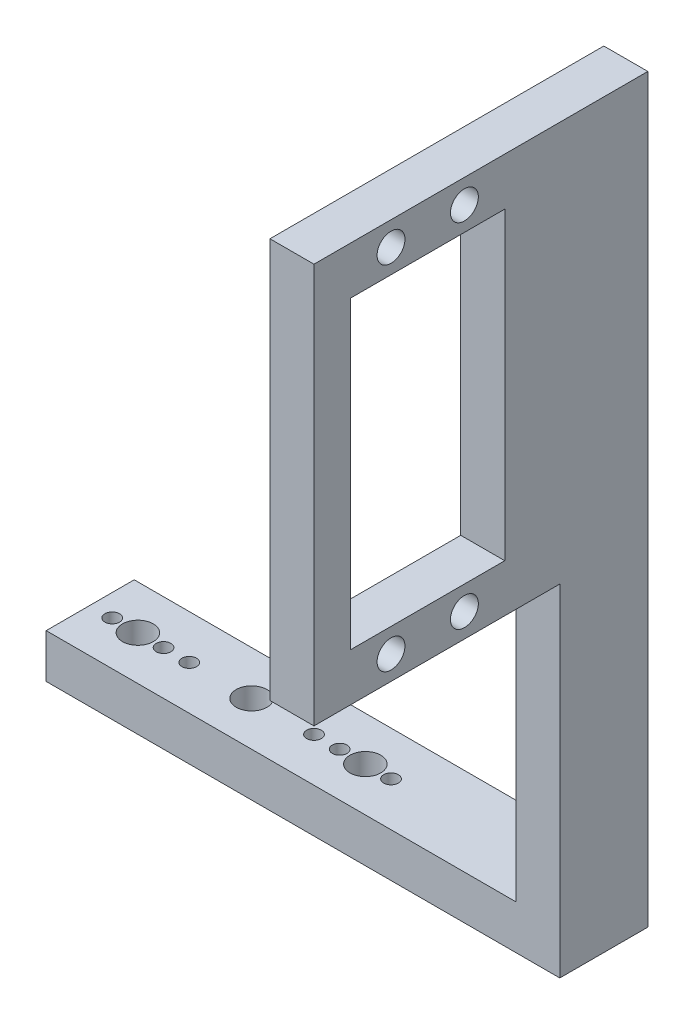
ISO-10303-21;
HEADER;
FILE_DESCRIPTION(('STEP AP214'),'2;1');
FILE_NAME('part.step','',(''),(''),'','','');
FILE_SCHEMA(('AUTOMOTIVE_DESIGN { 1 0 10303 214 1 1 1 1 }'));
ENDSEC;
DATA;
#1=APPLICATION_CONTEXT('core data for automotive mechanical design processes');
#2=APPLICATION_PROTOCOL_DEFINITION('international standard','automotive_design',2000,#1);
#3=PRODUCT_CONTEXT('',#1,'mechanical');
#4=PRODUCT('Part','Part','',(#3));
#5=PRODUCT_RELATED_PRODUCT_CATEGORY('part','',(#4));
#6=PRODUCT_DEFINITION_FORMATION('','',#4);
#7=PRODUCT_DEFINITION_CONTEXT('part definition',#1,'design');
#8=PRODUCT_DEFINITION('design','',#6,#7);
#9=PRODUCT_DEFINITION_SHAPE('','',#8);
#10=(LENGTH_UNIT() NAMED_UNIT(*) SI_UNIT(.MILLI.,.METRE.));
#11=(NAMED_UNIT(*) PLANE_ANGLE_UNIT() SI_UNIT($,.RADIAN.));
#12=(NAMED_UNIT(*) SI_UNIT($,.STERADIAN.) SOLID_ANGLE_UNIT());
#13=UNCERTAINTY_MEASURE_WITH_UNIT(LENGTH_MEASURE(1.E-05),#10,'distance_accuracy_value','');
#14=(GEOMETRIC_REPRESENTATION_CONTEXT(3) GLOBAL_UNCERTAINTY_ASSIGNED_CONTEXT((#13)) GLOBAL_UNIT_ASSIGNED_CONTEXT((#10,
#11,#12)) REPRESENTATION_CONTEXT('',''));
#15=CARTESIAN_POINT('',(0.,0.,0.));
#16=DIRECTION('',(0.,0.,1.));
#17=DIRECTION('',(1.,0.,0.));
#18=AXIS2_PLACEMENT_3D('',#15,#16,#17);
#19=CARTESIAN_POINT('',(-15.5,6.,0.));
#20=DIRECTION('',(0.,-1.,0.));
#21=DIRECTION('',(0.,0.,-1.));
#22=AXIS2_PLACEMENT_3D('',#19,#20,#21);
#23=CYLINDRICAL_SURFACE('',#22,1.);
#24=CARTESIAN_POINT('',(-15.5,0.,0.));
#25=DIRECTION('',(0.,1.,0.));
#26=DIRECTION('',(0.,0.,1.));
#27=AXIS2_PLACEMENT_3D('',#24,#25,#26);
#28=CIRCLE('',#27,1.);
#29=CARTESIAN_POINT('',(-15.5,0.,1.00000000000005));
#30=VERTEX_POINT('',#29);
#31=EDGE_CURVE('E288',#30,#30,#28,.T.);
#32=ORIENTED_EDGE('',*,*,#31,.F.);
#33=EDGE_LOOP('',(#32));
#34=FACE_BOUND('',#33,.T.);
#35=CARTESIAN_POINT('',(-15.5,2.5,0.));
#36=DIRECTION('',(0.,1.,0.));
#37=DIRECTION('',(0.,0.,1.));
#38=AXIS2_PLACEMENT_3D('',#35,#36,#37);
#39=CIRCLE('',#38,1.);
#40=CARTESIAN_POINT('',(-15.5,2.5,1.00000000000005));
#41=VERTEX_POINT('',#40);
#42=EDGE_CURVE('E41',#41,#41,#39,.T.);
#43=ORIENTED_EDGE('',*,*,#42,.T.);
#44=EDGE_LOOP('',(#43));
#45=FACE_BOUND('',#44,.T.);
#46=ADVANCED_FACE('F37',(#34,#45),#23,.F.);
#47=CARTESIAN_POINT('',(15.5,6.,0.));
#48=DIRECTION('',(0.,-1.,0.));
#49=DIRECTION('',(0.,0.,-1.));
#50=AXIS2_PLACEMENT_3D('',#47,#48,#49);
#51=CYLINDRICAL_SURFACE('',#50,1.);
#52=CARTESIAN_POINT('',(15.5,0.,0.));
#53=DIRECTION('',(0.,1.,0.));
#54=DIRECTION('',(0.,0.,1.));
#55=AXIS2_PLACEMENT_3D('',#52,#53,#54);
#56=CIRCLE('',#55,1.);
#57=CARTESIAN_POINT('',(15.5,0.,1.00000000000009));
#58=VERTEX_POINT('',#57);
#59=EDGE_CURVE('E249',#58,#58,#56,.F.);
#60=ORIENTED_EDGE('',*,*,#59,.T.);
#61=EDGE_LOOP('',(#60));
#62=FACE_BOUND('',#61,.T.);
#63=CARTESIAN_POINT('',(15.5,2.5,0.));
#64=DIRECTION('',(0.,1.,0.));
#65=DIRECTION('',(0.,0.,1.));
#66=AXIS2_PLACEMENT_3D('',#63,#64,#65);
#67=CIRCLE('',#66,1.);
#68=CARTESIAN_POINT('',(15.5,2.5,1.00000000000009));
#69=VERTEX_POINT('',#68);
#70=EDGE_CURVE('E299',#69,#69,#67,.F.);
#71=ORIENTED_EDGE('',*,*,#70,.F.);
#72=EDGE_LOOP('',(#71));
#73=FACE_BOUND('',#72,.T.);
#74=ADVANCED_FACE('F39',(#62,#73),#51,.F.);
#75=CARTESIAN_POINT('',(0.,6.,0.));
#76=DIRECTION('',(0.,-1.,0.));
#77=DIRECTION('',(0.,0.,-1.));
#78=AXIS2_PLACEMENT_3D('',#75,#76,#77);
#79=CYLINDRICAL_SURFACE('',#78,2.1);
#80=CARTESIAN_POINT('',(0.,6.,0.));
#81=DIRECTION('',(0.,1.,0.));
#82=DIRECTION('',(0.,0.,1.));
#83=AXIS2_PLACEMENT_3D('',#80,#81,#82);
#84=CIRCLE('',#83,2.1);
#85=CARTESIAN_POINT('',(0.,6.,2.1));
#86=VERTEX_POINT('',#85);
#87=EDGE_CURVE('E255',#86,#86,#84,.T.);
#88=ORIENTED_EDGE('',*,*,#87,.T.);
#89=EDGE_LOOP('',(#88));
#90=FACE_BOUND('',#89,.T.);
#91=CARTESIAN_POINT('',(0.,2.,0.));
#92=DIRECTION('',(0.,-1.,0.));
#93=DIRECTION('',(0.,0.,-1.));
#94=AXIS2_PLACEMENT_3D('',#91,#92,#93);
#95=CIRCLE('',#94,2.1);
#96=CARTESIAN_POINT('',(0.,2.,-2.1));
#97=VERTEX_POINT('',#96);
#98=EDGE_CURVE('E162',#97,#97,#95,.T.);
#99=ORIENTED_EDGE('',*,*,#98,.T.);
#100=EDGE_LOOP('',(#99));
#101=FACE_BOUND('',#100,.T.);
#102=ADVANCED_FACE('F350',(#90,#101),#79,.F.);
#103=CARTESIAN_POINT('',(0.,6.,-6.));
#104=DIRECTION('',(0.,0.,-1.));
#105=DIRECTION('',(-1.,0.,0.));
#106=AXIS2_PLACEMENT_3D('',#103,#104,#105);
#107=PLANE('',#106);
#108=DIRECTION('',(1.,0.,0.));
#109=VECTOR('',#108,1.);
#110=CARTESIAN_POINT('',(0.,0.,-6.));
#111=LINE('',#110,#109);
#112=CARTESIAN_POINT('',(-22.,0.,-5.99999999999999));
#113=VERTEX_POINT('',#112);
#114=CARTESIAN_POINT('',(48.,0.,-6.00000000000001));
#115=VERTEX_POINT('',#114);
#116=EDGE_CURVE('E147',#113,#115,#111,.T.);
#117=ORIENTED_EDGE('',*,*,#116,.F.);
#118=DIRECTION('',(0.,-1.,0.));
#119=VECTOR('',#118,1.);
#120=CARTESIAN_POINT('',(-22.,6.,-5.99999999999999));
#121=LINE('',#120,#119);
#122=CARTESIAN_POINT('',(-22.,6.,-5.99999999999999));
#123=VERTEX_POINT('',#122);
#124=EDGE_CURVE('E11',#123,#113,#121,.T.);
#125=ORIENTED_EDGE('',*,*,#124,.F.);
#126=DIRECTION('',(1.,0.,0.));
#127=VECTOR('',#126,1.);
#128=CARTESIAN_POINT('',(0.,6.,-6.));
#129=LINE('',#128,#127);
#130=CARTESIAN_POINT('',(42.,6.,-6.00000000000001));
#131=VERTEX_POINT('',#130);
#132=EDGE_CURVE('E73',#123,#131,#129,.T.);
#133=ORIENTED_EDGE('',*,*,#132,.T.);
#134=DIRECTION('',(0.,1.,0.));
#135=VECTOR('',#134,1.);
#136=CARTESIAN_POINT('',(42.,0.,-6.00000000000001));
#137=LINE('',#136,#135);
#138=CARTESIAN_POINT('',(42.,101.,-6.00000000000001));
#139=VERTEX_POINT('',#138);
#140=EDGE_CURVE('E198',#131,#139,#137,.T.);
#141=ORIENTED_EDGE('',*,*,#140,.T.);
#142=DIRECTION('',(-1.,0.,0.));
#143=VECTOR('',#142,1.);
#144=CARTESIAN_POINT('',(48.,101.,-6.00000000000001));
#145=LINE('',#144,#143);
#146=CARTESIAN_POINT('',(48.,101.,-6.00000000000001));
#147=VERTEX_POINT('',#146);
#148=EDGE_CURVE('E232',#147,#139,#145,.T.);
#149=ORIENTED_EDGE('',*,*,#148,.F.);
#150=DIRECTION('',(0.,1.,0.));
#151=VECTOR('',#150,1.);
#152=CARTESIAN_POINT('',(48.,0.,-6.00000000000001));
#153=LINE('',#152,#151);
#154=EDGE_CURVE('E150',#115,#147,#153,.T.);
#155=ORIENTED_EDGE('',*,*,#154,.F.);
#156=EDGE_LOOP('',(#117,#125,#133,#141,#149,#155));
#157=FACE_BOUND('',#156,.T.);
#158=ADVANCED_FACE('F372',(#157),#107,.T.);
#159=CARTESIAN_POINT('',(-22.,6.,0.));
#160=DIRECTION('',(1.,0.,0.));
#161=DIRECTION('',(0.,0.,-1.));
#162=AXIS2_PLACEMENT_3D('',#159,#160,#161);
#163=PLANE('',#162);
#164=DIRECTION('',(0.,0.,1.));
#165=VECTOR('',#164,1.);
#166=CARTESIAN_POINT('',(-22.,0.,0.));
#167=LINE('',#166,#165);
#168=CARTESIAN_POINT('',(-22.,0.,6.00000000000001));
#169=VERTEX_POINT('',#168);
#170=EDGE_CURVE('E140',#113,#169,#167,.T.);
#171=ORIENTED_EDGE('',*,*,#170,.T.);
#172=DIRECTION('',(0.,-1.,0.));
#173=VECTOR('',#172,1.);
#174=CARTESIAN_POINT('',(-22.,6.,6.00000000000001));
#175=LINE('',#174,#173);
#176=CARTESIAN_POINT('',(-22.,6.,6.00000000000001));
#177=VERTEX_POINT('',#176);
#178=EDGE_CURVE('E47',#177,#169,#175,.T.);
#179=ORIENTED_EDGE('',*,*,#178,.F.);
#180=DIRECTION('',(0.,0.,1.));
#181=VECTOR('',#180,1.);
#182=CARTESIAN_POINT('',(-22.,6.,0.));
#183=LINE('',#182,#181);
#184=EDGE_CURVE('E251',#123,#177,#183,.T.);
#185=ORIENTED_EDGE('',*,*,#184,.F.);
#186=ORIENTED_EDGE('',*,*,#124,.T.);
#187=EDGE_LOOP('',(#171,#179,#185,#186));
#188=FACE_BOUND('',#187,.T.);
#189=ADVANCED_FACE('F376',(#188),#163,.F.);
#190=CARTESIAN_POINT('',(12.,6.,0.));
#191=DIRECTION('',(0.,-1.,0.));
#192=DIRECTION('',(0.,0.,-1.));
#193=AXIS2_PLACEMENT_3D('',#190,#191,#192);
#194=CYLINDRICAL_SURFACE('',#193,1.);
#195=CARTESIAN_POINT('',(12.,6.,0.));
#196=DIRECTION('',(0.,1.,0.));
#197=DIRECTION('',(0.,0.,1.));
#198=AXIS2_PLACEMENT_3D('',#195,#196,#197);
#199=CIRCLE('',#198,1.);
#200=CARTESIAN_POINT('',(12.,6.,1.00000000000005));
#201=VERTEX_POINT('',#200);
#202=EDGE_CURVE('E270',#201,#201,#199,.F.);
#203=ORIENTED_EDGE('',*,*,#202,.F.);
#204=EDGE_LOOP('',(#203));
#205=FACE_BOUND('',#204,.T.);
#206=CARTESIAN_POINT('',(12.,0.,0.));
#207=DIRECTION('',(0.,1.,0.));
#208=DIRECTION('',(0.,0.,1.));
#209=AXIS2_PLACEMENT_3D('',#206,#207,#208);
#210=CIRCLE('',#209,1.);
#211=CARTESIAN_POINT('',(12.,0.,1.00000000000005));
#212=VERTEX_POINT('',#211);
#213=EDGE_CURVE('E294',#212,#212,#210,.F.);
#214=ORIENTED_EDGE('',*,*,#213,.T.);
#215=EDGE_LOOP('',(#214));
#216=FACE_BOUND('',#215,.T.);
#217=ADVANCED_FACE('F378',(#205,#216),#194,.F.);
#218=CARTESIAN_POINT('',(-19.,6.,0.));
#219=DIRECTION('',(0.,-1.,0.));
#220=DIRECTION('',(0.,0.,-1.));
#221=AXIS2_PLACEMENT_3D('',#218,#219,#220);
#222=CYLINDRICAL_SURFACE('',#221,1.);
#223=CARTESIAN_POINT('',(-19.,6.,0.));
#224=DIRECTION('',(0.,1.,0.));
#225=DIRECTION('',(0.,0.,1.));
#226=AXIS2_PLACEMENT_3D('',#223,#224,#225);
#227=CIRCLE('',#226,1.);
#228=CARTESIAN_POINT('',(-19.,6.,1.00000000000008));
#229=VERTEX_POINT('',#228);
#230=EDGE_CURVE('E267',#229,#229,#227,.T.);
#231=ORIENTED_EDGE('',*,*,#230,.T.);
#232=EDGE_LOOP('',(#231));
#233=FACE_BOUND('',#232,.T.);
#234=CARTESIAN_POINT('',(-19.,0.,0.));
#235=DIRECTION('',(0.,1.,0.));
#236=DIRECTION('',(0.,0.,1.));
#237=AXIS2_PLACEMENT_3D('',#234,#235,#236);
#238=CIRCLE('',#237,1.);
#239=CARTESIAN_POINT('',(-19.,0.,1.00000000000008));
#240=VERTEX_POINT('',#239);
#241=EDGE_CURVE('E291',#240,#240,#238,.T.);
#242=ORIENTED_EDGE('',*,*,#241,.F.);
#243=EDGE_LOOP('',(#242));
#244=FACE_BOUND('',#243,.T.);
#245=ADVANCED_FACE('F356',(#233,#244),#222,.F.);
#246=CARTESIAN_POINT('',(-12.,6.,0.));
#247=DIRECTION('',(0.,-1.,0.));
#248=DIRECTION('',(0.,0.,-1.));
#249=AXIS2_PLACEMENT_3D('',#246,#247,#248);
#250=CYLINDRICAL_SURFACE('',#249,1.);
#251=CARTESIAN_POINT('',(-12.,6.,0.));
#252=DIRECTION('',(0.,1.,0.));
#253=DIRECTION('',(0.,0.,1.));
#254=AXIS2_PLACEMENT_3D('',#251,#252,#253);
#255=CIRCLE('',#254,1.);
#256=CARTESIAN_POINT('',(-12.,6.,1.00000000000002));
#257=VERTEX_POINT('',#256);
#258=EDGE_CURVE('E264',#257,#257,#255,.T.);
#259=ORIENTED_EDGE('',*,*,#258,.T.);
#260=EDGE_LOOP('',(#259));
#261=FACE_BOUND('',#260,.T.);
#262=CARTESIAN_POINT('',(-12.,0.,0.));
#263=DIRECTION('',(0.,1.,0.));
#264=DIRECTION('',(0.,0.,1.));
#265=AXIS2_PLACEMENT_3D('',#262,#263,#264);
#266=CIRCLE('',#265,1.);
#267=CARTESIAN_POINT('',(-12.,0.,1.00000000000002));
#268=VERTEX_POINT('',#267);
#269=EDGE_CURVE('E285',#268,#268,#266,.T.);
#270=ORIENTED_EDGE('',*,*,#269,.F.);
#271=EDGE_LOOP('',(#270));
#272=FACE_BOUND('',#271,.T.);
#273=ADVANCED_FACE('F358',(#261,#272),#250,.F.);
#274=CARTESIAN_POINT('',(-8.50000000000001,6.,0.));
#275=DIRECTION('',(0.,-1.,0.));
#276=DIRECTION('',(0.,0.,-1.));
#277=AXIS2_PLACEMENT_3D('',#274,#275,#276);
#278=CYLINDRICAL_SURFACE('',#277,1.);
#279=CARTESIAN_POINT('',(-8.50000000000001,6.,0.));
#280=DIRECTION('',(0.,1.,0.));
#281=DIRECTION('',(0.,0.,1.));
#282=AXIS2_PLACEMENT_3D('',#279,#280,#281);
#283=CIRCLE('',#282,1.);
#284=CARTESIAN_POINT('',(-8.50000000000001,6.,1.));
#285=VERTEX_POINT('',#284);
#286=EDGE_CURVE('E261',#285,#285,#283,.T.);
#287=ORIENTED_EDGE('',*,*,#286,.T.);
#288=EDGE_LOOP('',(#287));
#289=FACE_BOUND('',#288,.T.);
#290=CARTESIAN_POINT('',(-8.50000000000001,0.,0.));
#291=DIRECTION('',(0.,1.,0.));
#292=DIRECTION('',(0.,0.,1.));
#293=AXIS2_PLACEMENT_3D('',#290,#291,#292);
#294=CIRCLE('',#293,1.);
#295=CARTESIAN_POINT('',(-8.50000000000001,0.,1.));
#296=VERTEX_POINT('',#295);
#297=EDGE_CURVE('E282',#296,#296,#294,.T.);
#298=ORIENTED_EDGE('',*,*,#297,.F.);
#299=EDGE_LOOP('',(#298));
#300=FACE_BOUND('',#299,.T.);
#301=ADVANCED_FACE('F361',(#289,#300),#278,.F.);
#302=CARTESIAN_POINT('',(8.5,6.,0.));
#303=DIRECTION('',(0.,-1.,0.));
#304=DIRECTION('',(0.,0.,-1.));
#305=AXIS2_PLACEMENT_3D('',#302,#303,#304);
#306=CYLINDRICAL_SURFACE('',#305,1.);
#307=CARTESIAN_POINT('',(8.5,6.,0.));
#308=DIRECTION('',(0.,1.,0.));
#309=DIRECTION('',(0.,0.,1.));
#310=AXIS2_PLACEMENT_3D('',#307,#308,#309);
#311=CIRCLE('',#310,1.);
#312=CARTESIAN_POINT('',(8.5,6.,0.999999999999999));
#313=VERTEX_POINT('',#312);
#314=EDGE_CURVE('E258',#313,#313,#311,.T.);
#315=ORIENTED_EDGE('',*,*,#314,.T.);
#316=EDGE_LOOP('',(#315));
#317=FACE_BOUND('',#316,.T.);
#318=CARTESIAN_POINT('',(8.5,0.,0.));
#319=DIRECTION('',(0.,1.,0.));
#320=DIRECTION('',(0.,0.,1.));
#321=AXIS2_PLACEMENT_3D('',#318,#319,#320);
#322=CIRCLE('',#321,1.);
#323=CARTESIAN_POINT('',(8.5,0.,0.999999999999999));
#324=VERTEX_POINT('',#323);
#325=EDGE_CURVE('E139',#324,#324,#322,.T.);
#326=ORIENTED_EDGE('',*,*,#325,.F.);
#327=EDGE_LOOP('',(#326));
#328=FACE_BOUND('',#327,.T.);
#329=ADVANCED_FACE('F365',(#317,#328),#306,.F.);
#330=CARTESIAN_POINT('',(0.,6.,6.));
#331=DIRECTION('',(0.,0.,-1.));
#332=DIRECTION('',(-1.,0.,0.));
#333=AXIS2_PLACEMENT_3D('',#330,#331,#332);
#334=PLANE('',#333);
#335=DIRECTION('',(1.,0.,0.));
#336=VECTOR('',#335,1.);
#337=CARTESIAN_POINT('',(0.,0.,6.));
#338=LINE('',#337,#336);
#339=CARTESIAN_POINT('',(48.,0.,5.99999999999999));
#340=VERTEX_POINT('',#339);
#341=EDGE_CURVE('E130',#169,#340,#338,.T.);
#342=ORIENTED_EDGE('',*,*,#341,.T.);
#343=DIRECTION('',(0.,1.,0.));
#344=VECTOR('',#343,1.);
#345=CARTESIAN_POINT('',(48.,0.,5.99999999999999));
#346=LINE('',#345,#344);
#347=CARTESIAN_POINT('',(48.,46.5,6.));
#348=VERTEX_POINT('',#347);
#349=EDGE_CURVE('E135',#340,#348,#346,.T.);
#350=ORIENTED_EDGE('',*,*,#349,.T.);
#351=DIRECTION('',(-1.,0.,0.));
#352=VECTOR('',#351,1.);
#353=CARTESIAN_POINT('',(48.,46.5,6.));
#354=LINE('',#353,#352);
#355=CARTESIAN_POINT('',(42.,46.5,6.));
#356=VERTEX_POINT('',#355);
#357=EDGE_CURVE('E195',#348,#356,#354,.T.);
#358=ORIENTED_EDGE('',*,*,#357,.T.);
#359=DIRECTION('',(0.,1.,0.));
#360=VECTOR('',#359,1.);
#361=CARTESIAN_POINT('',(42.,0.,5.99999999999999));
#362=LINE('',#361,#360);
#363=CARTESIAN_POINT('',(42.,6.,6.));
#364=VERTEX_POINT('',#363);
#365=EDGE_CURVE('E196',#364,#356,#362,.T.);
#366=ORIENTED_EDGE('',*,*,#365,.F.);
#367=DIRECTION('',(1.,0.,0.));
#368=VECTOR('',#367,1.);
#369=CARTESIAN_POINT('',(0.,6.,6.));
#370=LINE('',#369,#368);
#371=EDGE_CURVE('E56',#177,#364,#370,.T.);
#372=ORIENTED_EDGE('',*,*,#371,.F.);
#373=ORIENTED_EDGE('',*,*,#178,.T.);
#374=EDGE_LOOP('',(#342,#350,#358,#366,#372,#373));
#375=FACE_BOUND('',#374,.T.);
#376=ADVANCED_FACE('F132',(#375),#334,.F.);
#377=CARTESIAN_POINT('',(19.,6.,1.17702227244026E-13));
#378=DIRECTION('',(0.,-1.,0.));
#379=DIRECTION('',(0.,0.,-1.));
#380=AXIS2_PLACEMENT_3D('',#377,#378,#379);
#381=CYLINDRICAL_SURFACE('',#380,1.);
#382=CARTESIAN_POINT('',(19.,6.,1.17702227244026E-13));
#383=DIRECTION('',(0.,1.,0.));
#384=DIRECTION('',(0.,0.,1.));
#385=AXIS2_PLACEMENT_3D('',#382,#383,#384);
#386=CIRCLE('',#385,1.);
#387=CARTESIAN_POINT('',(19.,6.,1.00000000000012));
#388=VERTEX_POINT('',#387);
#389=EDGE_CURVE('E273',#388,#388,#386,.F.);
#390=ORIENTED_EDGE('',*,*,#389,.F.);
#391=EDGE_LOOP('',(#390));
#392=FACE_BOUND('',#391,.T.);
#393=CARTESIAN_POINT('',(19.,0.,1.17702227244026E-13));
#394=DIRECTION('',(0.,1.,0.));
#395=DIRECTION('',(0.,0.,1.));
#396=AXIS2_PLACEMENT_3D('',#393,#394,#395);
#397=CIRCLE('',#396,1.);
#398=CARTESIAN_POINT('',(19.,0.,1.00000000000012));
#399=VERTEX_POINT('',#398);
#400=EDGE_CURVE('E252',#399,#399,#397,.F.);
#401=ORIENTED_EDGE('',*,*,#400,.T.);
#402=EDGE_LOOP('',(#401));
#403=FACE_BOUND('',#402,.T.);
#404=ADVANCED_FACE('F339',(#392,#403),#381,.F.);
#405=CARTESIAN_POINT('',(0.,6.,0.));
#406=DIRECTION('',(0.,1.,0.));
#407=DIRECTION('',(0.,0.,1.));
#408=AXIS2_PLACEMENT_3D('',#405,#406,#407);
#409=PLANE('',#408);
#410=CARTESIAN_POINT('',(-15.5,6.,0.));
#411=DIRECTION('',(0.,1.,0.));
#412=DIRECTION('',(0.,0.,1.));
#413=AXIS2_PLACEMENT_3D('',#410,#411,#412);
#414=CIRCLE('',#413,2.1);
#415=CARTESIAN_POINT('',(-15.5,6.,2.10000000000005));
#416=VERTEX_POINT('',#415);
#417=EDGE_CURVE('E307',#416,#416,#414,.T.);
#418=ORIENTED_EDGE('',*,*,#417,.F.);
#419=EDGE_LOOP('',(#418));
#420=FACE_BOUND('',#419,.T.);
#421=CARTESIAN_POINT('',(15.5,6.,0.));
#422=DIRECTION('',(0.,1.,0.));
#423=DIRECTION('',(0.,0.,1.));
#424=AXIS2_PLACEMENT_3D('',#421,#422,#423);
#425=CIRCLE('',#424,2.1);
#426=CARTESIAN_POINT('',(15.5,6.,2.10000000000009));
#427=VERTEX_POINT('',#426);
#428=EDGE_CURVE('E317',#427,#427,#425,.T.);
#429=ORIENTED_EDGE('',*,*,#428,.F.);
#430=EDGE_LOOP('',(#429));
#431=FACE_BOUND('',#430,.T.);
#432=ORIENTED_EDGE('',*,*,#371,.T.);
#433=DIRECTION('',(0.,0.,1.));
#434=VECTOR('',#433,1.);
#435=CARTESIAN_POINT('',(42.,6.,5.99999999999999));
#436=LINE('',#435,#434);
#437=EDGE_CURVE('E239',#131,#364,#436,.T.);
#438=ORIENTED_EDGE('',*,*,#437,.F.);
#439=ORIENTED_EDGE('',*,*,#132,.F.);
#440=ORIENTED_EDGE('',*,*,#184,.T.);
#441=EDGE_LOOP('',(#432,#438,#439,#440));
#442=FACE_BOUND('',#441,.T.);
#443=ORIENTED_EDGE('',*,*,#87,.F.);
#444=EDGE_LOOP('',(#443));
#445=FACE_BOUND('',#444,.T.);
#446=ORIENTED_EDGE('',*,*,#314,.F.);
#447=EDGE_LOOP('',(#446));
#448=FACE_BOUND('',#447,.T.);
#449=ORIENTED_EDGE('',*,*,#286,.F.);
#450=EDGE_LOOP('',(#449));
#451=FACE_BOUND('',#450,.T.);
#452=ORIENTED_EDGE('',*,*,#258,.F.);
#453=EDGE_LOOP('',(#452));
#454=FACE_BOUND('',#453,.T.);
#455=ORIENTED_EDGE('',*,*,#230,.F.);
#456=EDGE_LOOP('',(#455));
#457=FACE_BOUND('',#456,.T.);
#458=ORIENTED_EDGE('',*,*,#202,.T.);
#459=EDGE_LOOP('',(#458));
#460=FACE_BOUND('',#459,.T.);
#461=ORIENTED_EDGE('',*,*,#389,.T.);
#462=EDGE_LOOP('',(#461));
#463=FACE_BOUND('',#462,.T.);
#464=ADVANCED_FACE('F329',(#420,#431,#442,#445,#448,#451,#454,#457,#460,#463),#409,.T.);
#465=CARTESIAN_POINT('',(0.,0.,0.));
#466=DIRECTION('',(0.,1.,0.));
#467=DIRECTION('',(0.,0.,1.));
#468=AXIS2_PLACEMENT_3D('',#465,#466,#467);
#469=PLANE('',#468);
#470=ORIENTED_EDGE('',*,*,#59,.F.);
#471=EDGE_LOOP('',(#470));
#472=FACE_BOUND('',#471,.T.);
#473=ORIENTED_EDGE('',*,*,#116,.T.);
#474=DIRECTION('',(0.,0.,-1.));
#475=VECTOR('',#474,1.);
#476=CARTESIAN_POINT('',(48.,0.,0.));
#477=LINE('',#476,#475);
#478=EDGE_CURVE('E143',#340,#115,#477,.T.);
#479=ORIENTED_EDGE('',*,*,#478,.F.);
#480=ORIENTED_EDGE('',*,*,#341,.F.);
#481=ORIENTED_EDGE('',*,*,#170,.F.);
#482=EDGE_LOOP('',(#473,#479,#480,#481));
#483=FACE_BOUND('',#482,.T.);
#484=ORIENTED_EDGE('',*,*,#325,.T.);
#485=EDGE_LOOP('',(#484));
#486=FACE_BOUND('',#485,.T.);
#487=ORIENTED_EDGE('',*,*,#297,.T.);
#488=EDGE_LOOP('',(#487));
#489=FACE_BOUND('',#488,.T.);
#490=ORIENTED_EDGE('',*,*,#269,.T.);
#491=EDGE_LOOP('',(#490));
#492=FACE_BOUND('',#491,.T.);
#493=ORIENTED_EDGE('',*,*,#31,.T.);
#494=EDGE_LOOP('',(#493));
#495=FACE_BOUND('',#494,.T.);
#496=ORIENTED_EDGE('',*,*,#241,.T.);
#497=EDGE_LOOP('',(#496));
#498=FACE_BOUND('',#497,.T.);
#499=ORIENTED_EDGE('',*,*,#213,.F.);
#500=EDGE_LOOP('',(#499));
#501=FACE_BOUND('',#500,.T.);
#502=ORIENTED_EDGE('',*,*,#400,.F.);
#503=EDGE_LOOP('',(#502));
#504=FACE_BOUND('',#503,.T.);
#505=CARTESIAN_POINT('',(0.,0.,0.));
#506=DIRECTION('',(0.,-1.,0.));
#507=DIRECTION('',(0.,0.,-1.));
#508=AXIS2_PLACEMENT_3D('',#505,#506,#507);
#509=CIRCLE('',#508,1.);
#510=CARTESIAN_POINT('',(0.,0.,-1.));
#511=VERTEX_POINT('',#510);
#512=EDGE_CURVE('E305',#511,#511,#509,.T.);
#513=ORIENTED_EDGE('',*,*,#512,.F.);
#514=EDGE_LOOP('',(#513));
#515=FACE_BOUND('',#514,.T.);
#516=ADVANCED_FACE('F144',(#472,#483,#486,#489,#492,#495,#498,#501,#504,#515),#469,.F.);
#517=CARTESIAN_POINT('',(42.,0.,0.));
#518=DIRECTION('',(1.,0.,0.));
#519=DIRECTION('',(0.,0.,-1.));
#520=AXIS2_PLACEMENT_3D('',#517,#518,#519);
#521=PLANE('',#520);
#522=CARTESIAN_POINT('',(42.,49.75,19.));
#523=DIRECTION('',(1.,0.,0.));
#524=DIRECTION('',(0.,0.,-1.));
#525=AXIS2_PLACEMENT_3D('',#522,#523,#524);
#526=CIRCLE('',#525,1.9);
#527=CARTESIAN_POINT('',(42.,49.75,17.1));
#528=VERTEX_POINT('',#527);
#529=EDGE_CURVE('E209',#528,#528,#526,.T.);
#530=ORIENTED_EDGE('',*,*,#529,.T.);
#531=EDGE_LOOP('',(#530));
#532=FACE_BOUND('',#531,.T.);
#533=CARTESIAN_POINT('',(42.,49.75,29.));
#534=DIRECTION('',(1.,0.,0.));
#535=DIRECTION('',(0.,0.,-1.));
#536=AXIS2_PLACEMENT_3D('',#533,#534,#535);
#537=CIRCLE('',#536,1.9);
#538=CARTESIAN_POINT('',(42.,49.75,27.1));
#539=VERTEX_POINT('',#538);
#540=EDGE_CURVE('E212',#539,#539,#537,.T.);
#541=ORIENTED_EDGE('',*,*,#540,.T.);
#542=EDGE_LOOP('',(#541));
#543=FACE_BOUND('',#542,.T.);
#544=CARTESIAN_POINT('',(42.,97.75,29.));
#545=DIRECTION('',(1.,0.,0.));
#546=DIRECTION('',(0.,0.,-1.));
#547=AXIS2_PLACEMENT_3D('',#544,#545,#546);
#548=CIRCLE('',#547,1.9);
#549=CARTESIAN_POINT('',(42.,97.75,27.1));
#550=VERTEX_POINT('',#549);
#551=EDGE_CURVE('E215',#550,#550,#548,.T.);
#552=ORIENTED_EDGE('',*,*,#551,.T.);
#553=EDGE_LOOP('',(#552));
#554=FACE_BOUND('',#553,.T.);
#555=CARTESIAN_POINT('',(42.,97.75,19.));
#556=DIRECTION('',(1.,0.,0.));
#557=DIRECTION('',(0.,0.,-1.));
#558=AXIS2_PLACEMENT_3D('',#555,#556,#557);
#559=CIRCLE('',#558,1.9);
#560=CARTESIAN_POINT('',(42.,97.75,17.1));
#561=VERTEX_POINT('',#560);
#562=EDGE_CURVE('E218',#561,#561,#559,.T.);
#563=ORIENTED_EDGE('',*,*,#562,.T.);
#564=EDGE_LOOP('',(#563));
#565=FACE_BOUND('',#564,.T.);
#566=DIRECTION('',(0.,-1.,0.));
#567=VECTOR('',#566,1.);
#568=CARTESIAN_POINT('',(42.,0.,34.5));
#569=LINE('',#568,#567);
#570=CARTESIAN_POINT('',(42.,94.5,34.5));
#571=VERTEX_POINT('',#570);
#572=CARTESIAN_POINT('',(42.,53.,34.5));
#573=VERTEX_POINT('',#572);
#574=EDGE_CURVE('E221',#571,#573,#569,.T.);
#575=ORIENTED_EDGE('',*,*,#574,.T.);
#576=DIRECTION('',(0.,0.,1.));
#577=VECTOR('',#576,1.);
#578=CARTESIAN_POINT('',(42.,53.,0.));
#579=LINE('',#578,#577);
#580=CARTESIAN_POINT('',(42.,53.,13.5));
#581=VERTEX_POINT('',#580);
#582=EDGE_CURVE('E156',#581,#573,#579,.T.);
#583=ORIENTED_EDGE('',*,*,#582,.F.);
#584=DIRECTION('',(0.,-1.,0.));
#585=VECTOR('',#584,1.);
#586=CARTESIAN_POINT('',(42.,0.,13.5));
#587=LINE('',#586,#585);
#588=CARTESIAN_POINT('',(42.,94.5,13.5));
#589=VERTEX_POINT('',#588);
#590=EDGE_CURVE('E159',#589,#581,#587,.T.);
#591=ORIENTED_EDGE('',*,*,#590,.F.);
#592=DIRECTION('',(0.,0.,1.));
#593=VECTOR('',#592,1.);
#594=CARTESIAN_POINT('',(42.,94.5,0.));
#595=LINE('',#594,#593);
#596=EDGE_CURVE('E224',#589,#571,#595,.T.);
#597=ORIENTED_EDGE('',*,*,#596,.T.);
#598=EDGE_LOOP('',(#575,#583,#591,#597));
#599=FACE_BOUND('',#598,.T.);
#600=ORIENTED_EDGE('',*,*,#140,.F.);
#601=ORIENTED_EDGE('',*,*,#437,.T.);
#602=ORIENTED_EDGE('',*,*,#365,.T.);
#603=DIRECTION('',(0.,0.,1.));
#604=VECTOR('',#603,1.);
#605=CARTESIAN_POINT('',(42.,46.5,0.));
#606=LINE('',#605,#604);
#607=CARTESIAN_POINT('',(42.,46.5,39.5));
#608=VERTEX_POINT('',#607);
#609=EDGE_CURVE('E206',#356,#608,#606,.T.);
#610=ORIENTED_EDGE('',*,*,#609,.T.);
#611=DIRECTION('',(0.,-1.,0.));
#612=VECTOR('',#611,1.);
#613=CARTESIAN_POINT('',(42.,0.,39.5));
#614=LINE('',#613,#612);
#615=CARTESIAN_POINT('',(42.,101.,39.5));
#616=VERTEX_POINT('',#615);
#617=EDGE_CURVE('E203',#616,#608,#614,.T.);
#618=ORIENTED_EDGE('',*,*,#617,.F.);
#619=DIRECTION('',(0.,0.,-1.));
#620=VECTOR('',#619,1.);
#621=CARTESIAN_POINT('',(42.,101.,0.));
#622=LINE('',#621,#620);
#623=EDGE_CURVE('E200',#616,#139,#622,.T.);
#624=ORIENTED_EDGE('',*,*,#623,.T.);
#625=EDGE_LOOP('',(#600,#601,#602,#610,#618,#624));
#626=FACE_BOUND('',#625,.T.);
#627=ADVANCED_FACE('F328',(#532,#543,#554,#565,#599,#626),#521,.F.);
#628=CARTESIAN_POINT('',(48.,0.,34.5));
#629=DIRECTION('',(0.,0.,-1.));
#630=DIRECTION('',(0.,1.,0.));
#631=AXIS2_PLACEMENT_3D('',#628,#629,#630);
#632=PLANE('',#631);
#633=ORIENTED_EDGE('',*,*,#574,.F.);
#634=DIRECTION('',(-1.,0.,0.));
#635=VECTOR('',#634,1.);
#636=CARTESIAN_POINT('',(48.,94.5,34.5));
#637=LINE('',#636,#635);
#638=CARTESIAN_POINT('',(48.,94.5,34.5));
#639=VERTEX_POINT('',#638);
#640=EDGE_CURVE('E237',#639,#571,#637,.T.);
#641=ORIENTED_EDGE('',*,*,#640,.F.);
#642=DIRECTION('',(0.,-1.,0.));
#643=VECTOR('',#642,1.);
#644=CARTESIAN_POINT('',(48.,0.,34.5));
#645=LINE('',#644,#643);
#646=CARTESIAN_POINT('',(48.,53.,34.5));
#647=VERTEX_POINT('',#646);
#648=EDGE_CURVE('E184',#639,#647,#645,.T.);
#649=ORIENTED_EDGE('',*,*,#648,.T.);
#650=DIRECTION('',(-1.,0.,0.));
#651=VECTOR('',#650,1.);
#652=CARTESIAN_POINT('',(48.,53.,34.5));
#653=LINE('',#652,#651);
#654=EDGE_CURVE('E229',#647,#573,#653,.T.);
#655=ORIENTED_EDGE('',*,*,#654,.T.);
#656=EDGE_LOOP('',(#633,#641,#649,#655));
#657=FACE_BOUND('',#656,.T.);
#658=ADVANCED_FACE('F336',(#657),#632,.T.);
#659=CARTESIAN_POINT('',(48.,94.5,0.));
#660=DIRECTION('',(0.,-1.,0.));
#661=DIRECTION('',(0.,0.,-1.));
#662=AXIS2_PLACEMENT_3D('',#659,#660,#661);
#663=PLANE('',#662);
#664=ORIENTED_EDGE('',*,*,#596,.F.);
#665=DIRECTION('',(-1.,0.,0.));
#666=VECTOR('',#665,1.);
#667=CARTESIAN_POINT('',(48.,94.5,13.5));
#668=LINE('',#667,#666);
#669=CARTESIAN_POINT('',(48.,94.5,13.5));
#670=VERTEX_POINT('',#669);
#671=EDGE_CURVE('E235',#670,#589,#668,.T.);
#672=ORIENTED_EDGE('',*,*,#671,.F.);
#673=DIRECTION('',(0.,0.,1.));
#674=VECTOR('',#673,1.);
#675=CARTESIAN_POINT('',(48.,94.5,0.));
#676=LINE('',#675,#674);
#677=EDGE_CURVE('E187',#670,#639,#676,.T.);
#678=ORIENTED_EDGE('',*,*,#677,.T.);
#679=ORIENTED_EDGE('',*,*,#640,.T.);
#680=EDGE_LOOP('',(#664,#672,#678,#679));
#681=FACE_BOUND('',#680,.T.);
#682=ADVANCED_FACE('F469',(#681),#663,.T.);
#683=CARTESIAN_POINT('',(48.,0.,13.5));
#684=DIRECTION('',(0.,0.,-1.));
#685=DIRECTION('',(-1.,0.,0.));
#686=AXIS2_PLACEMENT_3D('',#683,#684,#685);
#687=PLANE('',#686);
#688=ORIENTED_EDGE('',*,*,#590,.T.);
#689=DIRECTION('',(-1.,0.,0.));
#690=VECTOR('',#689,1.);
#691=CARTESIAN_POINT('',(48.,53.,13.5));
#692=LINE('',#691,#690);
#693=CARTESIAN_POINT('',(48.,53.,13.5));
#694=VERTEX_POINT('',#693);
#695=EDGE_CURVE('E231',#694,#581,#692,.T.);
#696=ORIENTED_EDGE('',*,*,#695,.F.);
#697=DIRECTION('',(0.,-1.,0.));
#698=VECTOR('',#697,1.);
#699=CARTESIAN_POINT('',(48.,0.,13.5));
#700=LINE('',#699,#698);
#701=EDGE_CURVE('E190',#670,#694,#700,.T.);
#702=ORIENTED_EDGE('',*,*,#701,.F.);
#703=ORIENTED_EDGE('',*,*,#671,.T.);
#704=EDGE_LOOP('',(#688,#696,#702,#703));
#705=FACE_BOUND('',#704,.T.);
#706=ADVANCED_FACE('F479',(#705),#687,.F.);
#707=CARTESIAN_POINT('',(48.,101.,0.));
#708=DIRECTION('',(0.,1.,0.));
#709=DIRECTION('',(0.,0.,1.));
#710=AXIS2_PLACEMENT_3D('',#707,#708,#709);
#711=PLANE('',#710);
#712=ORIENTED_EDGE('',*,*,#623,.F.);
#713=DIRECTION('',(-1.,0.,0.));
#714=VECTOR('',#713,1.);
#715=CARTESIAN_POINT('',(48.,101.,39.5));
#716=LINE('',#715,#714);
#717=CARTESIAN_POINT('',(48.,101.,39.5));
#718=VERTEX_POINT('',#717);
#719=EDGE_CURVE('E243',#718,#616,#716,.T.);
#720=ORIENTED_EDGE('',*,*,#719,.F.);
#721=DIRECTION('',(0.,0.,-1.));
#722=VECTOR('',#721,1.);
#723=CARTESIAN_POINT('',(48.,101.,0.));
#724=LINE('',#723,#722);
#725=EDGE_CURVE('E166',#718,#147,#724,.T.);
#726=ORIENTED_EDGE('',*,*,#725,.T.);
#727=ORIENTED_EDGE('',*,*,#148,.T.);
#728=EDGE_LOOP('',(#712,#720,#726,#727));
#729=FACE_BOUND('',#728,.T.);
#730=ADVANCED_FACE('F388',(#729),#711,.T.);
#731=CARTESIAN_POINT('',(48.,0.,39.5));
#732=DIRECTION('',(0.,0.,-1.));
#733=DIRECTION('',(-1.,0.,0.));
#734=AXIS2_PLACEMENT_3D('',#731,#732,#733);
#735=PLANE('',#734);
#736=ORIENTED_EDGE('',*,*,#617,.T.);
#737=DIRECTION('',(-1.,0.,0.));
#738=VECTOR('',#737,1.);
#739=CARTESIAN_POINT('',(48.,46.5,39.5));
#740=LINE('',#739,#738);
#741=CARTESIAN_POINT('',(48.,46.5,39.5));
#742=VERTEX_POINT('',#741);
#743=EDGE_CURVE('E241',#742,#608,#740,.T.);
#744=ORIENTED_EDGE('',*,*,#743,.F.);
#745=DIRECTION('',(0.,-1.,0.));
#746=VECTOR('',#745,1.);
#747=CARTESIAN_POINT('',(48.,0.,39.5));
#748=LINE('',#747,#746);
#749=EDGE_CURVE('E169',#718,#742,#748,.T.);
#750=ORIENTED_EDGE('',*,*,#749,.F.);
#751=ORIENTED_EDGE('',*,*,#719,.T.);
#752=EDGE_LOOP('',(#736,#744,#750,#751));
#753=FACE_BOUND('',#752,.T.);
#754=ADVANCED_FACE('F391',(#753),#735,.F.);
#755=CARTESIAN_POINT('',(48.,97.75,19.));
#756=DIRECTION('',(-1.,0.,0.));
#757=DIRECTION('',(0.,0.,1.));
#758=AXIS2_PLACEMENT_3D('',#755,#756,#757);
#759=CYLINDRICAL_SURFACE('',#758,1.9);
#760=CARTESIAN_POINT('',(48.,97.75,19.));
#761=DIRECTION('',(1.,0.,0.));
#762=DIRECTION('',(0.,0.,-1.));
#763=AXIS2_PLACEMENT_3D('',#760,#761,#762);
#764=CIRCLE('',#763,1.9);
#765=CARTESIAN_POINT('',(48.,97.75,17.1));
#766=VERTEX_POINT('',#765);
#767=EDGE_CURVE('E181',#766,#766,#764,.T.);
#768=ORIENTED_EDGE('',*,*,#767,.T.);
#769=EDGE_LOOP('',(#768));
#770=FACE_BOUND('',#769,.T.);
#771=ORIENTED_EDGE('',*,*,#562,.F.);
#772=EDGE_LOOP('',(#771));
#773=FACE_BOUND('',#772,.T.);
#774=ADVANCED_FACE('F507',(#770,#773),#759,.F.);
#775=CARTESIAN_POINT('',(48.,97.75,29.));
#776=DIRECTION('',(-1.,0.,0.));
#777=DIRECTION('',(0.,0.,1.));
#778=AXIS2_PLACEMENT_3D('',#775,#776,#777);
#779=CYLINDRICAL_SURFACE('',#778,1.9);
#780=CARTESIAN_POINT('',(48.,97.75,29.));
#781=DIRECTION('',(1.,0.,0.));
#782=DIRECTION('',(0.,0.,-1.));
#783=AXIS2_PLACEMENT_3D('',#780,#781,#782);
#784=CIRCLE('',#783,1.9);
#785=CARTESIAN_POINT('',(48.,97.75,27.1));
#786=VERTEX_POINT('',#785);
#787=EDGE_CURVE('E178',#786,#786,#784,.T.);
#788=ORIENTED_EDGE('',*,*,#787,.T.);
#789=EDGE_LOOP('',(#788));
#790=FACE_BOUND('',#789,.T.);
#791=ORIENTED_EDGE('',*,*,#551,.F.);
#792=EDGE_LOOP('',(#791));
#793=FACE_BOUND('',#792,.T.);
#794=ADVANCED_FACE('F516',(#790,#793),#779,.F.);
#795=CARTESIAN_POINT('',(48.,49.75,29.));
#796=DIRECTION('',(-1.,0.,0.));
#797=DIRECTION('',(0.,0.,1.));
#798=AXIS2_PLACEMENT_3D('',#795,#796,#797);
#799=CYLINDRICAL_SURFACE('',#798,1.9);
#800=CARTESIAN_POINT('',(48.,49.75,29.));
#801=DIRECTION('',(1.,0.,0.));
#802=DIRECTION('',(0.,0.,-1.));
#803=AXIS2_PLACEMENT_3D('',#800,#801,#802);
#804=CIRCLE('',#803,1.9);
#805=CARTESIAN_POINT('',(48.,49.75,27.1));
#806=VERTEX_POINT('',#805);
#807=EDGE_CURVE('E175',#806,#806,#804,.T.);
#808=ORIENTED_EDGE('',*,*,#807,.T.);
#809=EDGE_LOOP('',(#808));
#810=FACE_BOUND('',#809,.T.);
#811=ORIENTED_EDGE('',*,*,#540,.F.);
#812=EDGE_LOOP('',(#811));
#813=FACE_BOUND('',#812,.T.);
#814=ADVANCED_FACE('F526',(#810,#813),#799,.F.);
#815=CARTESIAN_POINT('',(48.,49.75,19.));
#816=DIRECTION('',(-1.,0.,0.));
#817=DIRECTION('',(0.,0.,1.));
#818=AXIS2_PLACEMENT_3D('',#815,#816,#817);
#819=CYLINDRICAL_SURFACE('',#818,1.9);
#820=CARTESIAN_POINT('',(48.,49.75,19.));
#821=DIRECTION('',(1.,0.,0.));
#822=DIRECTION('',(0.,0.,-1.));
#823=AXIS2_PLACEMENT_3D('',#820,#821,#822);
#824=CIRCLE('',#823,1.9);
#825=CARTESIAN_POINT('',(48.,49.75,17.1));
#826=VERTEX_POINT('',#825);
#827=EDGE_CURVE('E172',#826,#826,#824,.T.);
#828=ORIENTED_EDGE('',*,*,#827,.T.);
#829=EDGE_LOOP('',(#828));
#830=FACE_BOUND('',#829,.T.);
#831=ORIENTED_EDGE('',*,*,#529,.F.);
#832=EDGE_LOOP('',(#831));
#833=FACE_BOUND('',#832,.T.);
#834=ADVANCED_FACE('F536',(#830,#833),#819,.F.);
#835=CARTESIAN_POINT('',(48.,46.5,0.));
#836=DIRECTION('',(0.,-1.,0.));
#837=DIRECTION('',(0.,0.,-1.));
#838=AXIS2_PLACEMENT_3D('',#835,#836,#837);
#839=PLANE('',#838);
#840=ORIENTED_EDGE('',*,*,#609,.F.);
#841=ORIENTED_EDGE('',*,*,#357,.F.);
#842=DIRECTION('',(0.,0.,1.));
#843=VECTOR('',#842,1.);
#844=CARTESIAN_POINT('',(48.,46.5,0.));
#845=LINE('',#844,#843);
#846=EDGE_CURVE('E155',#348,#742,#845,.T.);
#847=ORIENTED_EDGE('',*,*,#846,.T.);
#848=ORIENTED_EDGE('',*,*,#743,.T.);
#849=EDGE_LOOP('',(#840,#841,#847,#848));
#850=FACE_BOUND('',#849,.T.);
#851=ADVANCED_FACE('F394',(#850),#839,.T.);
#852=CARTESIAN_POINT('',(48.,53.,0.));
#853=DIRECTION('',(0.,-1.,0.));
#854=DIRECTION('',(0.,0.,-1.));
#855=AXIS2_PLACEMENT_3D('',#852,#853,#854);
#856=PLANE('',#855);
#857=ORIENTED_EDGE('',*,*,#582,.T.);
#858=ORIENTED_EDGE('',*,*,#654,.F.);
#859=DIRECTION('',(0.,0.,1.));
#860=VECTOR('',#859,1.);
#861=CARTESIAN_POINT('',(48.,53.,0.));
#862=LINE('',#861,#860);
#863=EDGE_CURVE('E193',#694,#647,#862,.T.);
#864=ORIENTED_EDGE('',*,*,#863,.F.);
#865=ORIENTED_EDGE('',*,*,#695,.T.);
#866=EDGE_LOOP('',(#857,#858,#864,#865));
#867=FACE_BOUND('',#866,.T.);
#868=ADVANCED_FACE('F555',(#867),#856,.F.);
#869=CARTESIAN_POINT('',(48.,0.,0.));
#870=DIRECTION('',(1.,0.,0.));
#871=DIRECTION('',(0.,0.,-1.));
#872=AXIS2_PLACEMENT_3D('',#869,#870,#871);
#873=PLANE('',#872);
#874=ORIENTED_EDGE('',*,*,#349,.F.);
#875=ORIENTED_EDGE('',*,*,#478,.T.);
#876=ORIENTED_EDGE('',*,*,#154,.T.);
#877=ORIENTED_EDGE('',*,*,#725,.F.);
#878=ORIENTED_EDGE('',*,*,#749,.T.);
#879=ORIENTED_EDGE('',*,*,#846,.F.);
#880=EDGE_LOOP('',(#874,#875,#876,#877,#878,#879));
#881=FACE_BOUND('',#880,.T.);
#882=ORIENTED_EDGE('',*,*,#827,.F.);
#883=EDGE_LOOP('',(#882));
#884=FACE_BOUND('',#883,.T.);
#885=ORIENTED_EDGE('',*,*,#807,.F.);
#886=EDGE_LOOP('',(#885));
#887=FACE_BOUND('',#886,.T.);
#888=ORIENTED_EDGE('',*,*,#787,.F.);
#889=EDGE_LOOP('',(#888));
#890=FACE_BOUND('',#889,.T.);
#891=ORIENTED_EDGE('',*,*,#767,.F.);
#892=EDGE_LOOP('',(#891));
#893=FACE_BOUND('',#892,.T.);
#894=ORIENTED_EDGE('',*,*,#648,.F.);
#895=ORIENTED_EDGE('',*,*,#677,.F.);
#896=ORIENTED_EDGE('',*,*,#701,.T.);
#897=ORIENTED_EDGE('',*,*,#863,.T.);
#898=EDGE_LOOP('',(#894,#895,#896,#897));
#899=FACE_BOUND('',#898,.T.);
#900=ADVANCED_FACE('F152',(#881,#884,#887,#890,#893,#899),#873,.T.);
#901=CARTESIAN_POINT('',(0.,2.,0.));
#902=DIRECTION('',(0.,-1.,0.));
#903=DIRECTION('',(0.,0.,-1.));
#904=AXIS2_PLACEMENT_3D('',#901,#902,#903);
#905=PLANE('',#904);
#906=CARTESIAN_POINT('',(0.,2.,0.));
#907=DIRECTION('',(0.,-1.,0.));
#908=DIRECTION('',(0.,0.,-1.));
#909=AXIS2_PLACEMENT_3D('',#906,#907,#908);
#910=CIRCLE('',#909,1.);
#911=CARTESIAN_POINT('',(0.,2.,-1.));
#912=VERTEX_POINT('',#911);
#913=EDGE_CURVE('E320',#912,#912,#910,.T.);
#914=ORIENTED_EDGE('',*,*,#913,.T.);
#915=EDGE_LOOP('',(#914));
#916=FACE_BOUND('',#915,.T.);
#917=ORIENTED_EDGE('',*,*,#98,.F.);
#918=EDGE_LOOP('',(#917));
#919=FACE_BOUND('',#918,.T.);
#920=ADVANCED_FACE('F574',(#916,#919),#905,.F.);
#921=CARTESIAN_POINT('',(0.,2.,0.));
#922=DIRECTION('',(0.,-1.,0.));
#923=DIRECTION('',(0.,0.,-1.));
#924=AXIS2_PLACEMENT_3D('',#921,#922,#923);
#925=CYLINDRICAL_SURFACE('',#924,1.);
#926=ORIENTED_EDGE('',*,*,#913,.F.);
#927=EDGE_LOOP('',(#926));
#928=FACE_BOUND('',#927,.T.);
#929=ORIENTED_EDGE('',*,*,#512,.T.);
#930=EDGE_LOOP('',(#929));
#931=FACE_BOUND('',#930,.T.);
#932=ADVANCED_FACE('F325',(#928,#931),#925,.F.);
#933=CARTESIAN_POINT('',(15.5,2.5,0.));
#934=DIRECTION('',(0.,1.,0.));
#935=DIRECTION('',(0.,0.,1.));
#936=AXIS2_PLACEMENT_3D('',#933,#934,#935);
#937=PLANE('',#936);
#938=CARTESIAN_POINT('',(15.5,2.5,0.));
#939=DIRECTION('',(0.,1.,0.));
#940=DIRECTION('',(0.,0.,1.));
#941=AXIS2_PLACEMENT_3D('',#938,#939,#940);
#942=CIRCLE('',#941,2.1);
#943=CARTESIAN_POINT('',(15.5,2.5,2.10000000000009));
#944=VERTEX_POINT('',#943);
#945=EDGE_CURVE('E312',#944,#944,#942,.T.);
#946=ORIENTED_EDGE('',*,*,#945,.T.);
#947=EDGE_LOOP('',(#946));
#948=FACE_BOUND('',#947,.T.);
#949=ORIENTED_EDGE('',*,*,#70,.T.);
#950=EDGE_LOOP('',(#949));
#951=FACE_BOUND('',#950,.T.);
#952=ADVANCED_FACE('F603',(#948,#951),#937,.T.);
#953=CARTESIAN_POINT('',(15.5,2.5,0.));
#954=DIRECTION('',(0.,1.,0.));
#955=DIRECTION('',(0.,0.,1.));
#956=AXIS2_PLACEMENT_3D('',#953,#954,#955);
#957=CYLINDRICAL_SURFACE('',#956,2.1);
#958=ORIENTED_EDGE('',*,*,#945,.F.);
#959=EDGE_LOOP('',(#958));
#960=FACE_BOUND('',#959,.T.);
#961=ORIENTED_EDGE('',*,*,#428,.T.);
#962=EDGE_LOOP('',(#961));
#963=FACE_BOUND('',#962,.T.);
#964=ADVANCED_FACE('F633',(#960,#963),#957,.F.);
#965=CARTESIAN_POINT('',(-15.5,2.5,0.));
#966=DIRECTION('',(0.,1.,0.));
#967=DIRECTION('',(0.,0.,1.));
#968=AXIS2_PLACEMENT_3D('',#965,#966,#967);
#969=CYLINDRICAL_SURFACE('',#968,2.1);
#970=CARTESIAN_POINT('',(-15.5,2.5,0.));
#971=DIRECTION('',(0.,1.,0.));
#972=DIRECTION('',(0.,0.,1.));
#973=AXIS2_PLACEMENT_3D('',#970,#971,#972);
#974=CIRCLE('',#973,2.1);
#975=CARTESIAN_POINT('',(-15.5,2.5,2.10000000000005));
#976=VERTEX_POINT('',#975);
#977=EDGE_CURVE('E301',#976,#976,#974,.T.);
#978=ORIENTED_EDGE('',*,*,#977,.F.);
#979=EDGE_LOOP('',(#978));
#980=FACE_BOUND('',#979,.T.);
#981=ORIENTED_EDGE('',*,*,#417,.T.);
#982=EDGE_LOOP('',(#981));
#983=FACE_BOUND('',#982,.T.);
#984=ADVANCED_FACE('F643',(#980,#983),#969,.F.);
#985=CARTESIAN_POINT('',(-15.5,2.5,0.));
#986=DIRECTION('',(0.,1.,0.));
#987=DIRECTION('',(0.,0.,1.));
#988=AXIS2_PLACEMENT_3D('',#985,#986,#987);
#989=PLANE('',#988);
#990=ORIENTED_EDGE('',*,*,#42,.F.);
#991=EDGE_LOOP('',(#990));
#992=FACE_BOUND('',#991,.T.);
#993=ORIENTED_EDGE('',*,*,#977,.T.);
#994=EDGE_LOOP('',(#993));
#995=FACE_BOUND('',#994,.T.);
#996=ADVANCED_FACE('F653',(#992,#995),#989,.T.);
#997=CLOSED_SHELL('',(#46,#74,#102,#158,#189,#217,#245,#273,#301,#329,#376,#404,#464,#516,#627,
#658,#682,#706,#730,#754,#774,#794,#814,#834,#851,#868,#900,#920,#932,#952,#964,#984,#996));
#998=MANIFOLD_SOLID_BREP('B2',#997);
#999=ADVANCED_BREP_SHAPE_REPRESENTATION('',(#18,#998),#14);
#1000=SHAPE_DEFINITION_REPRESENTATION(#9,#999);
ENDSEC;
END-ISO-10303-21;
